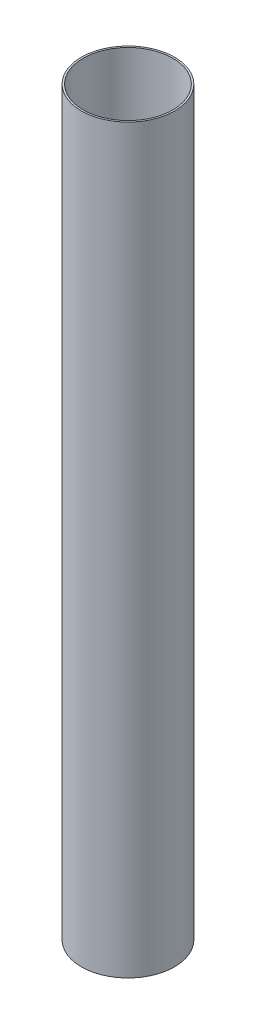
ISO-10303-21;
HEADER;
FILE_DESCRIPTION(('STEP AP214'),'2;1');
FILE_NAME('part.step','',(''),(''),'','','');
FILE_SCHEMA(('AUTOMOTIVE_DESIGN { 1 0 10303 214 1 1 1 1 }'));
ENDSEC;
DATA;
#1=APPLICATION_CONTEXT('core data for automotive mechanical design processes');
#2=APPLICATION_PROTOCOL_DEFINITION('international standard','automotive_design',2000,#1);
#3=PRODUCT_CONTEXT('',#1,'mechanical');
#4=PRODUCT('Part','Part','',(#3));
#5=PRODUCT_RELATED_PRODUCT_CATEGORY('part','',(#4));
#6=PRODUCT_DEFINITION_FORMATION('','',#4);
#7=PRODUCT_DEFINITION_CONTEXT('part definition',#1,'design');
#8=PRODUCT_DEFINITION('design','',#6,#7);
#9=PRODUCT_DEFINITION_SHAPE('','',#8);
#10=(LENGTH_UNIT() NAMED_UNIT(*) SI_UNIT(.MILLI.,.METRE.));
#11=(NAMED_UNIT(*) PLANE_ANGLE_UNIT() SI_UNIT($,.RADIAN.));
#12=(NAMED_UNIT(*) SI_UNIT($,.STERADIAN.) SOLID_ANGLE_UNIT());
#13=UNCERTAINTY_MEASURE_WITH_UNIT(LENGTH_MEASURE(1.E-05),#10,'distance_accuracy_value','');
#14=(GEOMETRIC_REPRESENTATION_CONTEXT(3) GLOBAL_UNCERTAINTY_ASSIGNED_CONTEXT((#13)) GLOBAL_UNIT_ASSIGNED_CONTEXT((#10,
#11,#12)) REPRESENTATION_CONTEXT('',''));
#15=CARTESIAN_POINT('',(0.,0.,0.));
#16=DIRECTION('',(0.,0.,1.));
#17=DIRECTION('',(1.,0.,0.));
#18=AXIS2_PLACEMENT_3D('',#15,#16,#17);
#19=CARTESIAN_POINT('',(0.,-315.,0.));
#20=DIRECTION('',(0.,1.,0.));
#21=DIRECTION('',(0.,0.,1.));
#22=AXIS2_PLACEMENT_3D('',#19,#20,#21);
#23=CYLINDRICAL_SURFACE('',#22,39.6);
#24=CARTESIAN_POINT('',(0.,-315.,0.));
#25=DIRECTION('',(0.,1.,0.));
#26=DIRECTION('',(0.,0.,1.));
#27=AXIS2_PLACEMENT_3D('',#24,#25,#26);
#28=CIRCLE('',#27,39.6);
#29=CARTESIAN_POINT('',(0.,-315.,39.6));
#30=VERTEX_POINT('',#29);
#31=EDGE_CURVE('E10',#30,#30,#28,.T.);
#32=ORIENTED_EDGE('',*,*,#31,.T.);
#33=EDGE_LOOP('',(#32));
#34=FACE_BOUND('',#33,.T.);
#35=CARTESIAN_POINT('',(0.,315.,0.));
#36=DIRECTION('',(0.,1.,0.));
#37=DIRECTION('',(0.,0.,1.));
#38=AXIS2_PLACEMENT_3D('',#35,#36,#37);
#39=CIRCLE('',#38,39.6);
#40=CARTESIAN_POINT('',(0.,315.,39.6));
#41=VERTEX_POINT('',#40);
#42=EDGE_CURVE('E45',#41,#41,#39,.T.);
#43=ORIENTED_EDGE('',*,*,#42,.F.);
#44=EDGE_LOOP('',(#43));
#45=FACE_BOUND('',#44,.T.);
#46=ADVANCED_FACE('F35',(#34,#45),#23,.T.);
#47=CARTESIAN_POINT('',(0.,-315.,0.));
#48=DIRECTION('',(0.,1.,0.));
#49=DIRECTION('',(0.,0.,1.));
#50=AXIS2_PLACEMENT_3D('',#47,#48,#49);
#51=PLANE('',#50);
#52=CARTESIAN_POINT('',(0.,-315.,0.));
#53=DIRECTION('',(0.,1.,0.));
#54=DIRECTION('',(0.,0.,1.));
#55=AXIS2_PLACEMENT_3D('',#52,#53,#54);
#56=CIRCLE('',#55,38.1);
#57=CARTESIAN_POINT('',(0.,-315.,38.1));
#58=VERTEX_POINT('',#57);
#59=EDGE_CURVE('E41',#58,#58,#56,.T.);
#60=ORIENTED_EDGE('',*,*,#59,.T.);
#61=EDGE_LOOP('',(#60));
#62=FACE_BOUND('',#61,.T.);
#63=ORIENTED_EDGE('',*,*,#31,.F.);
#64=EDGE_LOOP('',(#63));
#65=FACE_BOUND('',#64,.T.);
#66=ADVANCED_FACE('F64',(#62,#65),#51,.F.);
#67=CARTESIAN_POINT('',(0.,-315.,0.));
#68=DIRECTION('',(0.,1.,0.));
#69=DIRECTION('',(0.,0.,1.));
#70=AXIS2_PLACEMENT_3D('',#67,#68,#69);
#71=CYLINDRICAL_SURFACE('',#70,38.1);
#72=ORIENTED_EDGE('',*,*,#59,.F.);
#73=EDGE_LOOP('',(#72));
#74=FACE_BOUND('',#73,.T.);
#75=CARTESIAN_POINT('',(0.,315.,0.));
#76=DIRECTION('',(0.,1.,0.));
#77=DIRECTION('',(0.,0.,1.));
#78=AXIS2_PLACEMENT_3D('',#75,#76,#77);
#79=CIRCLE('',#78,38.1);
#80=CARTESIAN_POINT('',(0.,315.,38.1));
#81=VERTEX_POINT('',#80);
#82=EDGE_CURVE('E49',#81,#81,#79,.T.);
#83=ORIENTED_EDGE('',*,*,#82,.T.);
#84=EDGE_LOOP('',(#83));
#85=FACE_BOUND('',#84,.T.);
#86=ADVANCED_FACE('F55',(#74,#85),#71,.F.);
#87=CARTESIAN_POINT('',(0.,315.,0.));
#88=DIRECTION('',(0.,1.,0.));
#89=DIRECTION('',(0.,0.,1.));
#90=AXIS2_PLACEMENT_3D('',#87,#88,#89);
#91=PLANE('',#90);
#92=ORIENTED_EDGE('',*,*,#42,.T.);
#93=EDGE_LOOP('',(#92));
#94=FACE_BOUND('',#93,.T.);
#95=ORIENTED_EDGE('',*,*,#82,.F.);
#96=EDGE_LOOP('',(#95));
#97=FACE_BOUND('',#96,.T.);
#98=ADVANCED_FACE('F57',(#94,#97),#91,.T.);
#99=CLOSED_SHELL('',(#46,#66,#86,#98));
#100=MANIFOLD_SOLID_BREP('B2',#99);
#101=ADVANCED_BREP_SHAPE_REPRESENTATION('',(#18,#100),#14);
#102=SHAPE_DEFINITION_REPRESENTATION(#9,#101);
ENDSEC;
END-ISO-10303-21;
